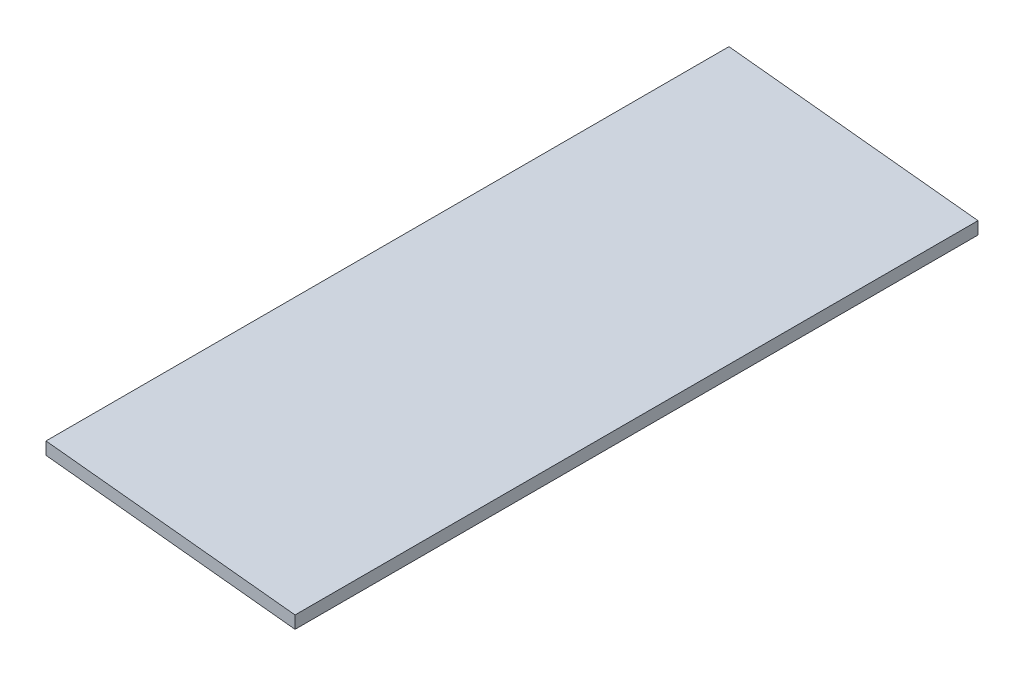
ISO-10303-21;
HEADER;
FILE_DESCRIPTION(('STEP AP214'),'2;1');
FILE_NAME('part.step','',(''),(''),'','','');
FILE_SCHEMA(('AUTOMOTIVE_DESIGN { 1 0 10303 214 1 1 1 1 }'));
ENDSEC;
DATA;
#1=APPLICATION_CONTEXT('core data for automotive mechanical design processes');
#2=APPLICATION_PROTOCOL_DEFINITION('international standard','automotive_design',2000,#1);
#3=PRODUCT_CONTEXT('',#1,'mechanical');
#4=PRODUCT('Part','Part','',(#3));
#5=PRODUCT_RELATED_PRODUCT_CATEGORY('part','',(#4));
#6=PRODUCT_DEFINITION_FORMATION('','',#4);
#7=PRODUCT_DEFINITION_CONTEXT('part definition',#1,'design');
#8=PRODUCT_DEFINITION('design','',#6,#7);
#9=PRODUCT_DEFINITION_SHAPE('','',#8);
#10=(LENGTH_UNIT() NAMED_UNIT(*) SI_UNIT(.MILLI.,.METRE.));
#11=(NAMED_UNIT(*) PLANE_ANGLE_UNIT() SI_UNIT($,.RADIAN.));
#12=(NAMED_UNIT(*) SI_UNIT($,.STERADIAN.) SOLID_ANGLE_UNIT());
#13=UNCERTAINTY_MEASURE_WITH_UNIT(LENGTH_MEASURE(1.E-05),#10,'distance_accuracy_value','');
#14=(GEOMETRIC_REPRESENTATION_CONTEXT(3) GLOBAL_UNCERTAINTY_ASSIGNED_CONTEXT((#13)) GLOBAL_UNIT_ASSIGNED_CONTEXT((#10,
#11,#12)) REPRESENTATION_CONTEXT('',''));
#15=CARTESIAN_POINT('',(0.,0.,0.));
#16=DIRECTION('',(0.,0.,1.));
#17=DIRECTION('',(1.,0.,0.));
#18=AXIS2_PLACEMENT_3D('',#15,#16,#17);
#19=CARTESIAN_POINT('',(120.337149339561,-12.6479440553861,165.));
#20=DIRECTION('',(0.104528463267654,0.994521895368273,0.));
#21=DIRECTION('',(-0.994521895368273,0.104528463267654,0.));
#22=AXIS2_PLACEMENT_3D('',#19,#20,#21);
#23=PLANE('',#22);
#24=DIRECTION('',(0.994521895368273,-0.104528463267654,0.));
#25=VECTOR('',#24,1.);
#26=CARTESIAN_POINT('',(120.337149339561,-12.6479440553861,-165.));
#27=LINE('',#26,#25);
#28=CARTESIAN_POINT('',(0.,0.,-165.));
#29=VERTEX_POINT('',#28);
#30=CARTESIAN_POINT('',(120.337149339561,-12.6479440553861,-165.));
#31=VERTEX_POINT('',#30);
#32=EDGE_CURVE('E107',#29,#31,#27,.T.);
#33=ORIENTED_EDGE('',*,*,#32,.T.);
#34=DIRECTION('',(0.,0.,-1.));
#35=VECTOR('',#34,1.);
#36=CARTESIAN_POINT('',(120.337149339561,-12.6479440553861,165.));
#37=LINE('',#36,#35);
#38=CARTESIAN_POINT('',(120.337149339561,-12.6479440553861,165.));
#39=VERTEX_POINT('',#38);
#40=EDGE_CURVE('E11',#39,#31,#37,.T.);
#41=ORIENTED_EDGE('',*,*,#40,.F.);
#42=DIRECTION('',(0.994521895368273,-0.104528463267654,0.));
#43=VECTOR('',#42,1.);
#44=CARTESIAN_POINT('',(120.337149339561,-12.6479440553861,165.));
#45=LINE('',#44,#43);
#46=CARTESIAN_POINT('',(0.,0.,165.));
#47=VERTEX_POINT('',#46);
#48=EDGE_CURVE('E91',#47,#39,#45,.T.);
#49=ORIENTED_EDGE('',*,*,#48,.F.);
#50=DIRECTION('',(0.,0.,-1.));
#51=VECTOR('',#50,1.);
#52=CARTESIAN_POINT('',(0.,0.,165.));
#53=LINE('',#52,#51);
#54=EDGE_CURVE('E103',#47,#29,#53,.T.);
#55=ORIENTED_EDGE('',*,*,#54,.T.);
#56=EDGE_LOOP('',(#33,#41,#49,#55));
#57=FACE_BOUND('',#56,.T.);
#58=ADVANCED_FACE('F39',(#57),#23,.F.);
#59=CARTESIAN_POINT('',(120.337149339561,-6.61489437800497,165.));
#60=DIRECTION('',(-1.,0.,0.));
#61=DIRECTION('',(0.,-1.,0.));
#62=AXIS2_PLACEMENT_3D('',#59,#60,#61);
#63=PLANE('',#62);
#64=DIRECTION('',(0.,1.,0.));
#65=VECTOR('',#64,1.);
#66=CARTESIAN_POINT('',(120.337149339561,-6.61489437800497,-165.));
#67=LINE('',#66,#65);
#68=CARTESIAN_POINT('',(120.337149339561,-6.61489437800497,-165.));
#69=VERTEX_POINT('',#68);
#70=EDGE_CURVE('E96',#31,#69,#67,.T.);
#71=ORIENTED_EDGE('',*,*,#70,.T.);
#72=DIRECTION('',(0.,0.,-1.));
#73=VECTOR('',#72,1.);
#74=CARTESIAN_POINT('',(120.337149339561,-6.61489437800497,165.));
#75=LINE('',#74,#73);
#76=CARTESIAN_POINT('',(120.337149339561,-6.61489437800497,165.));
#77=VERTEX_POINT('',#76);
#78=EDGE_CURVE('E48',#77,#69,#75,.T.);
#79=ORIENTED_EDGE('',*,*,#78,.F.);
#80=DIRECTION('',(0.,1.,0.));
#81=VECTOR('',#80,1.);
#82=CARTESIAN_POINT('',(120.337149339561,-6.61489437800497,165.));
#83=LINE('',#82,#81);
#84=EDGE_CURVE('E86',#39,#77,#83,.T.);
#85=ORIENTED_EDGE('',*,*,#84,.F.);
#86=ORIENTED_EDGE('',*,*,#40,.T.);
#87=EDGE_LOOP('',(#71,#79,#85,#86));
#88=FACE_BOUND('',#87,.T.);
#89=ADVANCED_FACE('F95',(#88),#63,.F.);
#90=CARTESIAN_POINT('',(0.,6.0330496773811,165.));
#91=DIRECTION('',(-0.104528463267653,-0.994521895368273,0.));
#92=DIRECTION('',(0.994521895368273,-0.104528463267653,0.));
#93=AXIS2_PLACEMENT_3D('',#90,#91,#92);
#94=PLANE('',#93);
#95=DIRECTION('',(-0.994521895368273,0.104528463267653,0.));
#96=VECTOR('',#95,1.);
#97=CARTESIAN_POINT('',(0.,6.0330496773811,-165.));
#98=LINE('',#97,#96);
#99=CARTESIAN_POINT('',(0.,6.0330496773811,-165.));
#100=VERTEX_POINT('',#99);
#101=EDGE_CURVE('E73',#69,#100,#98,.T.);
#102=ORIENTED_EDGE('',*,*,#101,.T.);
#103=DIRECTION('',(0.,0.,-1.));
#104=VECTOR('',#103,1.);
#105=CARTESIAN_POINT('',(0.,6.0330496773811,165.));
#106=LINE('',#105,#104);
#107=CARTESIAN_POINT('',(0.,6.0330496773811,165.));
#108=VERTEX_POINT('',#107);
#109=EDGE_CURVE('E98',#108,#100,#106,.T.);
#110=ORIENTED_EDGE('',*,*,#109,.F.);
#111=DIRECTION('',(-0.994521895368273,0.104528463267653,0.));
#112=VECTOR('',#111,1.);
#113=CARTESIAN_POINT('',(0.,6.0330496773811,165.));
#114=LINE('',#113,#112);
#115=EDGE_CURVE('E89',#77,#108,#114,.T.);
#116=ORIENTED_EDGE('',*,*,#115,.F.);
#117=ORIENTED_EDGE('',*,*,#78,.T.);
#118=EDGE_LOOP('',(#102,#110,#116,#117));
#119=FACE_BOUND('',#118,.T.);
#120=ADVANCED_FACE('F99',(#119),#94,.F.);
#121=CARTESIAN_POINT('',(0.,0.,165.));
#122=DIRECTION('',(1.,0.,0.));
#123=DIRECTION('',(0.,1.,0.));
#124=AXIS2_PLACEMENT_3D('',#121,#122,#123);
#125=PLANE('',#124);
#126=DIRECTION('',(0.,-1.,0.));
#127=VECTOR('',#126,1.);
#128=CARTESIAN_POINT('',(0.,0.,-165.));
#129=LINE('',#128,#127);
#130=EDGE_CURVE('E79',#100,#29,#129,.T.);
#131=ORIENTED_EDGE('',*,*,#130,.T.);
#132=ORIENTED_EDGE('',*,*,#54,.F.);
#133=DIRECTION('',(0.,-1.,0.));
#134=VECTOR('',#133,1.);
#135=CARTESIAN_POINT('',(0.,0.,165.));
#136=LINE('',#135,#134);
#137=EDGE_CURVE('E56',#108,#47,#136,.T.);
#138=ORIENTED_EDGE('',*,*,#137,.F.);
#139=ORIENTED_EDGE('',*,*,#109,.T.);
#140=EDGE_LOOP('',(#131,#132,#138,#139));
#141=FACE_BOUND('',#140,.T.);
#142=ADVANCED_FACE('F120',(#141),#125,.F.);
#143=CARTESIAN_POINT('',(0.,0.,165.));
#144=DIRECTION('',(0.,0.,-1.));
#145=DIRECTION('',(-1.,0.,0.));
#146=AXIS2_PLACEMENT_3D('',#143,#144,#145);
#147=PLANE('',#146);
#148=ORIENTED_EDGE('',*,*,#48,.T.);
#149=ORIENTED_EDGE('',*,*,#84,.T.);
#150=ORIENTED_EDGE('',*,*,#115,.T.);
#151=ORIENTED_EDGE('',*,*,#137,.T.);
#152=EDGE_LOOP('',(#148,#149,#150,#151));
#153=FACE_BOUND('',#152,.T.);
#154=ADVANCED_FACE('F87',(#153),#147,.F.);
#155=CARTESIAN_POINT('',(0.,0.,-165.));
#156=DIRECTION('',(0.,0.,-1.));
#157=DIRECTION('',(-1.,0.,0.));
#158=AXIS2_PLACEMENT_3D('',#155,#156,#157);
#159=PLANE('',#158);
#160=ORIENTED_EDGE('',*,*,#32,.F.);
#161=ORIENTED_EDGE('',*,*,#130,.F.);
#162=ORIENTED_EDGE('',*,*,#101,.F.);
#163=ORIENTED_EDGE('',*,*,#70,.F.);
#164=EDGE_LOOP('',(#160,#161,#162,#163));
#165=FACE_BOUND('',#164,.T.);
#166=ADVANCED_FACE('F123',(#165),#159,.T.);
#167=CLOSED_SHELL('',(#58,#89,#120,#142,#154,#166));
#168=MANIFOLD_SOLID_BREP('B2',#167);
#169=ADVANCED_BREP_SHAPE_REPRESENTATION('',(#18,#168),#14);
#170=SHAPE_DEFINITION_REPRESENTATION(#9,#169);
ENDSEC;
END-ISO-10303-21;
